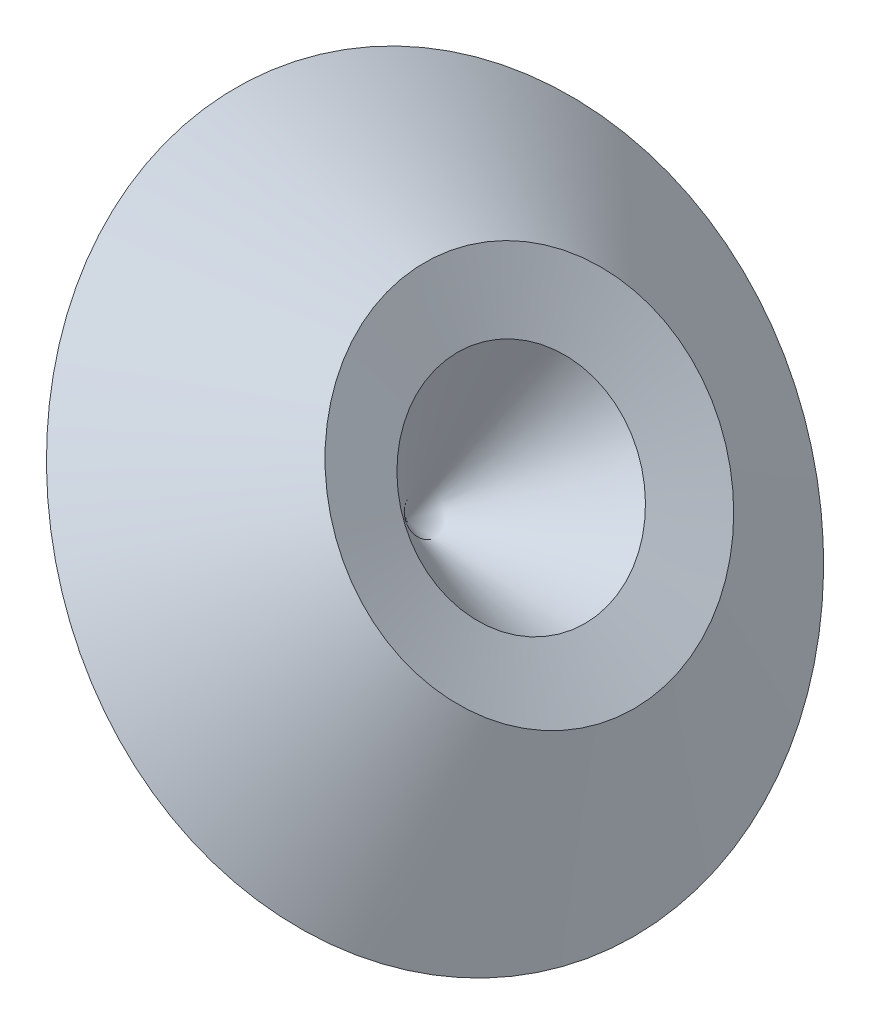
ISO-10303-21;
HEADER;
FILE_DESCRIPTION(('STEP AP214'),'2;1');
FILE_NAME('part.step','',(''),(''),'','','');
FILE_SCHEMA(('AUTOMOTIVE_DESIGN { 1 0 10303 214 1 1 1 1 }'));
ENDSEC;
DATA;
#1=APPLICATION_CONTEXT('core data for automotive mechanical design processes');
#2=APPLICATION_PROTOCOL_DEFINITION('international standard','automotive_design',2000,#1);
#3=PRODUCT_CONTEXT('',#1,'mechanical');
#4=PRODUCT('Part','Part','',(#3));
#5=PRODUCT_RELATED_PRODUCT_CATEGORY('part','',(#4));
#6=PRODUCT_DEFINITION_FORMATION('','',#4);
#7=PRODUCT_DEFINITION_CONTEXT('part definition',#1,'design');
#8=PRODUCT_DEFINITION('design','',#6,#7);
#9=PRODUCT_DEFINITION_SHAPE('','',#8);
#10=(LENGTH_UNIT() NAMED_UNIT(*) SI_UNIT(.MILLI.,.METRE.));
#11=(NAMED_UNIT(*) PLANE_ANGLE_UNIT() SI_UNIT($,.RADIAN.));
#12=(NAMED_UNIT(*) SI_UNIT($,.STERADIAN.) SOLID_ANGLE_UNIT());
#13=UNCERTAINTY_MEASURE_WITH_UNIT(LENGTH_MEASURE(1.E-05),#10,'distance_accuracy_value','');
#14=(GEOMETRIC_REPRESENTATION_CONTEXT(3) GLOBAL_UNCERTAINTY_ASSIGNED_CONTEXT((#13)) GLOBAL_UNIT_ASSIGNED_CONTEXT((#10,
#11,#12)) REPRESENTATION_CONTEXT('',''));
#15=CARTESIAN_POINT('',(0.,0.,0.));
#16=DIRECTION('',(0.,0.,1.));
#17=DIRECTION('',(1.,0.,0.));
#18=AXIS2_PLACEMENT_3D('',#15,#16,#17);
#19=CARTESIAN_POINT('',(0.,0.,0.));
#20=DIRECTION('',(-0.802945922722566,-0.596051881284849,0.));
#21=DIRECTION('',(0.596051881284849,-0.802945922722566,0.));
#22=AXIS2_PLACEMENT_3D('',#19,#20,#21);
#23=CONICAL_SURFACE('',#22,0.,0.932221286530035);
#24=CARTESIAN_POINT('',(-16.4111057995632,-12.1824773113322,0.));
#25=DIRECTION('',(-0.802945922722566,-0.596051881284849,0.));
#26=DIRECTION('',(0.596051881284849,-0.802945922722566,0.));
#27=AXIS2_PLACEMENT_3D('',#24,#25,#26);
#28=CIRCLE('',#27,27.5330156901568);
#29=CARTESIAN_POINT('',(0.,-34.29,0.));
#30=VERTEX_POINT('',#29);
#31=EDGE_CURVE('E100',#30,#30,#28,.T.);
#32=ORIENTED_EDGE('',*,*,#31,.T.);
#33=EDGE_LOOP('',(#32));
#34=FACE_BOUND('',#33,.T.);
#35=CARTESIAN_POINT('',(0.,0.,0.));
#36=VERTEX_POINT('',#35);
#37=VERTEX_LOOP('',#36);
#38=FACE_BOUND('',#37,.T.);
#39=ADVANCED_FACE('F47',(#34,#38),#23,.F.);
#40=CARTESIAN_POINT('',(74.8174330788014,55.5393214879446,0.));
#41=DIRECTION('',(0.802945922722566,0.596051881284849,0.));
#42=DIRECTION('',(-0.596051881284849,0.802945922722566,0.));
#43=AXIS2_PLACEMENT_3D('',#40,#41,#42);
#44=CONICAL_SURFACE('',#43,33.155981948351,0.638575040264861);
#45=CARTESIAN_POINT('',(38.9541184949625,28.9168609686532,0.));
#46=VERTEX_POINT('',#45);
#47=VERTEX_LOOP('',#46);
#48=FACE_BOUND('',#47,.T.);
#49=CARTESIAN_POINT('',(74.8174330788014,55.5393214879446,0.));
#50=DIRECTION('',(-0.802945922722566,-0.596051881284849,0.));
#51=DIRECTION('',(0.596051881284849,-0.802945922722566,0.));
#52=AXIS2_PLACEMENT_3D('',#49,#50,#51);
#53=CIRCLE('',#52,33.155981948351);
#54=CARTESIAN_POINT('',(94.5801184949625,28.9168609686532,0.));
#55=VERTEX_POINT('',#54);
#56=EDGE_CURVE('E11',#55,#55,#53,.T.);
#57=ORIENTED_EDGE('',*,*,#56,.F.);
#58=EDGE_LOOP('',(#57));
#59=FACE_BOUND('',#58,.T.);
#60=ADVANCED_FACE('F61',(#48,#59),#44,.F.);
#61=CARTESIAN_POINT('',(77.3535654929783,57.4219719303703,0.));
#62=DIRECTION('',(0.802945922722566,0.596051881284849,0.));
#63=DIRECTION('',(-0.596051881284849,0.802945922722566,0.));
#64=AXIS2_PLACEMENT_3D('',#61,#62,#63);
#65=CONICAL_SURFACE('',#64,54.5136915561108,1.42397320366231);
#66=ORIENTED_EDGE('',*,*,#56,.T.);
#67=EDGE_LOOP('',(#66));
#68=FACE_BOUND('',#67,.T.);
#69=CARTESIAN_POINT('',(77.3535654929783,57.4219719303703,0.));
#70=DIRECTION('',(-0.802945922722566,-0.596051881284849,0.));
#71=DIRECTION('',(0.596051881284849,-0.802945922722566,0.));
#72=AXIS2_PLACEMENT_3D('',#69,#70,#71);
#73=CIRCLE('',#72,54.5136915561108);
#74=CARTESIAN_POINT('',(109.84655390078,13.6504255628356,0.));
#75=VERTEX_POINT('',#74);
#76=EDGE_CURVE('E55',#75,#75,#73,.T.);
#77=ORIENTED_EDGE('',*,*,#76,.F.);
#78=EDGE_LOOP('',(#77));
#79=FACE_BOUND('',#78,.T.);
#80=ADVANCED_FACE('F64',(#68,#79),#65,.F.);
#81=CARTESIAN_POINT('',(48.0567025470914,35.6739939153255,0.));
#82=DIRECTION('',(-0.802945922722566,-0.596051881284849,0.));
#83=DIRECTION('',(0.596051881284849,-0.802945922722566,0.));
#84=AXIS2_PLACEMENT_3D('',#81,#82,#83);
#85=CONICAL_SURFACE('',#84,103.66522326965,0.932221286530036);
#86=ORIENTED_EDGE('',*,*,#76,.T.);
#87=EDGE_LOOP('',(#86));
#88=FACE_BOUND('',#87,.T.);
#89=CARTESIAN_POINT('',(48.0567025470914,35.6739939153255,0.));
#90=DIRECTION('',(-0.802945922722566,-0.596051881284849,0.));
#91=DIRECTION('',(0.596051881284849,-0.802945922722566,0.));
#92=AXIS2_PLACEMENT_3D('',#89,#90,#91);
#93=CIRCLE('',#92,103.66522326965);
#94=CARTESIAN_POINT('',(109.84655390078,-47.5635744371644,0.));
#95=VERTEX_POINT('',#94);
#96=EDGE_CURVE('E75',#95,#95,#93,.T.);
#97=ORIENTED_EDGE('',*,*,#96,.F.);
#98=EDGE_LOOP('',(#97));
#99=FACE_BOUND('',#98,.T.);
#100=ADVANCED_FACE('F69',(#88,#99),#85,.T.);
#101=CARTESIAN_POINT('',(38.63116000597,28.6771187774378,0.));
#102=DIRECTION('',(0.802945922722566,0.596051881284849,0.));
#103=DIRECTION('',(-0.596051881284849,0.802945922722566,0.));
#104=AXIS2_PLACEMENT_3D('',#101,#102,#103);
#105=CONICAL_SURFACE('',#104,94.9512178305748,0.638575040264862);
#106=ORIENTED_EDGE('',*,*,#96,.T.);
#107=EDGE_LOOP('',(#106));
#108=FACE_BOUND('',#107,.T.);
#109=CARTESIAN_POINT('',(38.63116000597,28.6771187774378,0.));
#110=DIRECTION('',(-0.802945922722566,-0.596051881284849,0.));
#111=DIRECTION('',(0.596051881284849,-0.802945922722566,0.));
#112=AXIS2_PLACEMENT_3D('',#109,#110,#111);
#113=CIRCLE('',#112,94.9512178305748);
#114=CARTESIAN_POINT('',(95.2270120241716,-47.5635744371644,0.));
#115=VERTEX_POINT('',#114);
#116=EDGE_CURVE('E78',#115,#115,#113,.T.);
#117=ORIENTED_EDGE('',*,*,#116,.F.);
#118=EDGE_LOOP('',(#117));
#119=FACE_BOUND('',#118,.T.);
#120=ADVANCED_FACE('F129',(#108,#119),#105,.T.);
#121=CARTESIAN_POINT('',(53.2188096055817,39.505987498622,0.));
#122=DIRECTION('',(-0.802945922722566,-0.596051881284849,0.));
#123=DIRECTION('',(0.596051881284849,-0.802945922722566,0.));
#124=AXIS2_PLACEMENT_3D('',#121,#122,#123);
#125=CONICAL_SURFACE('',#124,70.477426105991,0.932221286530035);
#126=ORIENTED_EDGE('',*,*,#116,.T.);
#127=EDGE_LOOP('',(#126));
#128=FACE_BOUND('',#127,.T.);
#129=CARTESIAN_POINT('',(53.2188096055817,39.505987498622,0.));
#130=DIRECTION('',(-0.802945922722566,-0.596051881284849,0.));
#131=DIRECTION('',(0.596051881284849,-0.802945922722566,0.));
#132=AXIS2_PLACEMENT_3D('',#129,#130,#131);
#133=CIRCLE('',#132,70.477426105991);
#134=CARTESIAN_POINT('',(95.2270120241715,-17.0835744371644,0.));
#135=VERTEX_POINT('',#134);
#136=EDGE_CURVE('E84',#135,#135,#133,.T.);
#137=ORIENTED_EDGE('',*,*,#136,.F.);
#138=EDGE_LOOP('',(#137));
#139=FACE_BOUND('',#138,.T.);
#140=ADVANCED_FACE('F135',(#128,#139),#125,.F.);
#141=CARTESIAN_POINT('',(35.7708240824438,26.5538019262312,0.));
#142=DIRECTION('',(0.802945922722566,0.596051881284849,0.));
#143=DIRECTION('',(-0.596051881284849,0.802945922722566,0.));
#144=AXIS2_PLACEMENT_3D('',#141,#142,#143);
#145=CONICAL_SURFACE('',#144,47.2265999594628,0.819196671403653);
#146=ORIENTED_EDGE('',*,*,#136,.T.);
#147=EDGE_LOOP('',(#146));
#148=FACE_BOUND('',#147,.T.);
#149=CARTESIAN_POINT('',(35.7708240824438,26.5538019262312,0.));
#150=DIRECTION('',(-0.802945922722566,-0.596051881284849,0.));
#151=DIRECTION('',(0.596051881284849,-0.802945922722566,0.));
#152=AXIS2_PLACEMENT_3D('',#149,#150,#151);
#153=CIRCLE('',#152,47.2265999594628);
#154=CARTESIAN_POINT('',(63.9203278349685,-11.3666039552691,0.));
#155=VERTEX_POINT('',#154);
#156=EDGE_CURVE('E88',#155,#155,#153,.T.);
#157=ORIENTED_EDGE('',*,*,#156,.F.);
#158=EDGE_LOOP('',(#157));
#159=FACE_BOUND('',#158,.T.);
#160=ADVANCED_FACE('F142',(#148,#159),#145,.T.);
#161=CARTESIAN_POINT('',(22.8585712084723,16.9686326148782,0.));
#162=DIRECTION('',(-0.802945922722566,-0.596051881284849,0.));
#163=DIRECTION('',(0.596051881284849,-0.802945922722566,0.));
#164=AXIS2_PLACEMENT_3D('',#161,#162,#163);
#165=CONICAL_SURFACE('',#164,49.604790656466,0.146823123132588);
#166=ORIENTED_EDGE('',*,*,#156,.T.);
#167=EDGE_LOOP('',(#166));
#168=FACE_BOUND('',#167,.T.);
#169=CARTESIAN_POINT('',(22.8585712084723,16.9686326148782,0.));
#170=DIRECTION('',(-0.802945922722566,-0.596051881284849,0.));
#171=DIRECTION('',(0.596051881284849,-0.802945922722566,0.));
#172=AXIS2_PLACEMENT_3D('',#169,#170,#171);
#173=CIRCLE('',#172,49.604790656466);
#174=CARTESIAN_POINT('',(52.4256,-22.8613317902376,0.));
#175=VERTEX_POINT('',#174);
#176=EDGE_CURVE('E92',#175,#175,#173,.T.);
#177=ORIENTED_EDGE('',*,*,#176,.F.);
#178=EDGE_LOOP('',(#177));
#179=FACE_BOUND('',#178,.T.);
#180=ADVANCED_FACE('F113',(#168,#179),#165,.T.);
#181=CARTESIAN_POINT('',(17.38884,12.90828,0.));
#182=DIRECTION('',(-0.802945922722566,-0.596051881284849,0.));
#183=DIRECTION('',(0.596051881284849,-0.802945922722566,0.));
#184=AXIS2_PLACEMENT_3D('',#181,#182,#183);
#185=CONICAL_SURFACE('',#184,58.7813931976437,0.932221286530035);
#186=ORIENTED_EDGE('',*,*,#176,.T.);
#187=EDGE_LOOP('',(#186));
#188=FACE_BOUND('',#187,.T.);
#189=CARTESIAN_POINT('',(17.38884,12.90828,0.));
#190=DIRECTION('',(-0.802945922722566,-0.596051881284849,0.));
#191=DIRECTION('',(0.596051881284849,-0.802945922722566,0.));
#192=AXIS2_PLACEMENT_3D('',#189,#190,#191);
#193=CIRCLE('',#192,58.7813931976438);
#194=CARTESIAN_POINT('',(52.4256,-34.29,0.));
#195=VERTEX_POINT('',#194);
#196=EDGE_CURVE('E96',#195,#195,#193,.T.);
#197=ORIENTED_EDGE('',*,*,#196,.F.);
#198=EDGE_LOOP('',(#197));
#199=FACE_BOUND('',#198,.T.);
#200=ADVANCED_FACE('F108',(#188,#199),#185,.T.);
#201=CARTESIAN_POINT('',(-16.4111057995632,-12.1824773113322,0.));
#202=DIRECTION('',(0.802945922722566,0.596051881284849,0.));
#203=DIRECTION('',(-0.596051881284849,0.802945922722566,0.));
#204=AXIS2_PLACEMENT_3D('',#201,#202,#203);
#205=CONICAL_SURFACE('',#204,27.5330156901568,0.638575040264861);
#206=ORIENTED_EDGE('',*,*,#196,.T.);
#207=EDGE_LOOP('',(#206));
#208=FACE_BOUND('',#207,.T.);
#209=ORIENTED_EDGE('',*,*,#31,.F.);
#210=EDGE_LOOP('',(#209));
#211=FACE_BOUND('',#210,.T.);
#212=ADVANCED_FACE('F106',(#208,#211),#205,.T.);
#213=CLOSED_SHELL('',(#39,#60,#80,#100,#120,#140,#160,#180,#200,#212));
#214=MANIFOLD_SOLID_BREP('B2',#213);
#215=ADVANCED_BREP_SHAPE_REPRESENTATION('',(#18,#214),#14);
#216=SHAPE_DEFINITION_REPRESENTATION(#9,#215);
ENDSEC;
END-ISO-10303-21;
